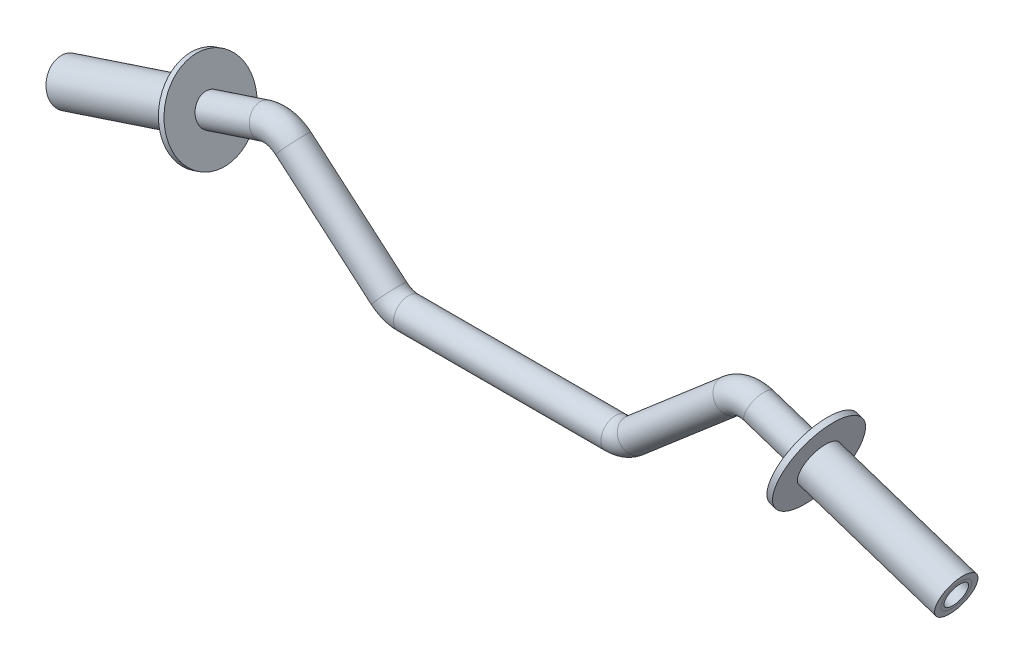
ISO-10303-21;
HEADER;
FILE_DESCRIPTION(('STEP AP214'),'2;1');
FILE_NAME('part.step','',(''),(''),'','','');
FILE_SCHEMA(('AUTOMOTIVE_DESIGN { 1 0 10303 214 1 1 1 1 }'));
ENDSEC;
DATA;
#1=APPLICATION_CONTEXT('core data for automotive mechanical design processes');
#2=APPLICATION_PROTOCOL_DEFINITION('international standard','automotive_design',2000,#1);
#3=PRODUCT_CONTEXT('',#1,'mechanical');
#4=PRODUCT('Part','Part','',(#3));
#5=PRODUCT_RELATED_PRODUCT_CATEGORY('part','',(#4));
#6=PRODUCT_DEFINITION_FORMATION('','',#4);
#7=PRODUCT_DEFINITION_CONTEXT('part definition',#1,'design');
#8=PRODUCT_DEFINITION('design','',#6,#7);
#9=PRODUCT_DEFINITION_SHAPE('','',#8);
#10=(LENGTH_UNIT() NAMED_UNIT(*) SI_UNIT(.MILLI.,.METRE.));
#11=(NAMED_UNIT(*) PLANE_ANGLE_UNIT() SI_UNIT($,.RADIAN.));
#12=(NAMED_UNIT(*) SI_UNIT($,.STERADIAN.) SOLID_ANGLE_UNIT());
#13=UNCERTAINTY_MEASURE_WITH_UNIT(LENGTH_MEASURE(1.E-05),#10,'distance_accuracy_value','');
#14=(GEOMETRIC_REPRESENTATION_CONTEXT(3) GLOBAL_UNCERTAINTY_ASSIGNED_CONTEXT((#13)) GLOBAL_UNIT_ASSIGNED_CONTEXT((#10,
#11,#12)) REPRESENTATION_CONTEXT('',''));
#15=CARTESIAN_POINT('',(0.,0.,0.));
#16=DIRECTION('',(0.,0.,1.));
#17=DIRECTION('',(1.,0.,0.));
#18=AXIS2_PLACEMENT_3D('',#15,#16,#17);
#19=CARTESIAN_POINT('',(-166.897824544563,63.9897667994018,0.));
#20=DIRECTION('',(-0.949488339970091,-0.313802313982609,0.));
#21=DIRECTION('',(-0.313802313982609,0.949488339970091,0.));
#22=AXIS2_PLACEMENT_3D('',#19,#20,#21);
#23=CYLINDRICAL_SURFACE('',#22,10.);
#24=CARTESIAN_POINT('',(-166.897824544563,63.9897667994018,0.));
#25=DIRECTION('',(0.949488339970091,0.31380231398261,0.));
#26=DIRECTION('',(0.,0.,-1.));
#27=AXIS2_PLACEMENT_3D('',#24,#25,#26);
#28=CIRCLE('',#27,10.);
#29=CARTESIAN_POINT('',(-170.035847684389,73.4846501991027,0.));
#30=VERTEX_POINT('',#29);
#31=EDGE_CURVE('E55',#30,#30,#28,.T.);
#32=ORIENTED_EDGE('',*,*,#31,.F.);
#33=EDGE_LOOP('',(#32));
#34=FACE_BOUND('',#33,.T.);
#35=CARTESIAN_POINT('',(-300.,20.,0.));
#36=DIRECTION('',(0.949488339970091,0.31380231398261,0.));
#37=DIRECTION('',(0.,0.,-1.));
#38=AXIS2_PLACEMENT_3D('',#35,#36,#37);
#39=CIRCLE('',#38,10.);
#40=CARTESIAN_POINT('',(-300.,20.,-10.));
#41=VERTEX_POINT('',#40);
#42=EDGE_CURVE('E11',#41,#41,#39,.T.);
#43=ORIENTED_EDGE('',*,*,#42,.T.);
#44=EDGE_LOOP('',(#43));
#45=FACE_BOUND('',#44,.T.);
#46=ADVANCED_FACE('F45',(#34,#45),#23,.T.);
#47=CARTESIAN_POINT('',(-166.897824544563,63.9897667994018,0.));
#48=DIRECTION('',(-0.949488339970091,-0.313802313982609,0.));
#49=DIRECTION('',(-0.313802313982609,0.949488339970091,0.));
#50=AXIS2_PLACEMENT_3D('',#47,#48,#49);
#51=CYLINDRICAL_SURFACE('',#50,8.);
#52=CARTESIAN_POINT('',(-166.897824544563,63.9897667994018,0.));
#53=DIRECTION('',(0.949488339970091,0.31380231398261,0.));
#54=DIRECTION('',(0.,0.,-1.));
#55=AXIS2_PLACEMENT_3D('',#52,#53,#54);
#56=CIRCLE('',#55,8.);
#57=CARTESIAN_POINT('',(-169.408243056424,71.5856735191626,0.));
#58=VERTEX_POINT('',#57);
#59=EDGE_CURVE('E59',#58,#58,#56,.T.);
#60=ORIENTED_EDGE('',*,*,#59,.T.);
#61=EDGE_LOOP('',(#60));
#62=FACE_BOUND('',#61,.T.);
#63=CARTESIAN_POINT('',(-300.,20.,0.));
#64=DIRECTION('',(0.949488339970091,0.31380231398261,0.));
#65=DIRECTION('',(0.,0.,-1.));
#66=AXIS2_PLACEMENT_3D('',#63,#64,#65);
#67=CIRCLE('',#66,8.);
#68=CARTESIAN_POINT('',(-300.,20.,-8.));
#69=VERTEX_POINT('',#68);
#70=EDGE_CURVE('E51',#69,#69,#67,.T.);
#71=ORIENTED_EDGE('',*,*,#70,.F.);
#72=EDGE_LOOP('',(#71));
#73=FACE_BOUND('',#72,.T.);
#74=ADVANCED_FACE('F159',(#62,#73),#51,.F.);
#75=CARTESIAN_POINT('',(-160.621778264911,45.,0.));
#76=DIRECTION('',(0.,0.,-1.));
#77=DIRECTION('',(1.,0.,0.));
#78=AXIS2_PLACEMENT_3D('',#75,#76,#77);
#79=TOROIDAL_SURFACE('',#78,20.,10.);
#80=CARTESIAN_POINT('',(-147.604961339319,60.1842838858353,0.));
#81=DIRECTION('',(0.759214194291763,-0.650840846279571,0.));
#82=DIRECTION('',(0.,0.,-1.));
#83=AXIS2_PLACEMENT_3D('',#80,#81,#82);
#84=CIRCLE('',#83,10.);
#85=CARTESIAN_POINT('',(-141.096552876523,67.7764258287529,0.));
#86=VERTEX_POINT('',#85);
#87=EDGE_CURVE('E64',#86,#86,#84,.T.);
#88=CARTESIAN_POINT('',(-160.621778264911,45.,0.));
#89=DIRECTION('',(0.,0.,-1.));
#90=DIRECTION('',(1.,0.,0.));
#91=AXIS2_PLACEMENT_3D('',#88,#89,#90);
#92=CIRCLE('',#91,30.);
#93=EDGE_CURVE('',#30,#86,#92,.T.);
#94=ORIENTED_EDGE('',*,*,#31,.T.);
#95=ORIENTED_EDGE('',*,*,#87,.F.);
#96=ORIENTED_EDGE('',*,*,#93,.T.);
#97=ORIENTED_EDGE('',*,*,#93,.F.);
#98=EDGE_LOOP('',(#94,#96,#95,#97));
#99=FACE_BOUND('',#98,.T.);
#100=ADVANCED_FACE('F164',(#99),#79,.T.);
#101=CARTESIAN_POINT('',(-160.621778264911,45.,0.));
#102=DIRECTION('',(0.,0.,-1.));
#103=DIRECTION('',(1.,0.,0.));
#104=AXIS2_PLACEMENT_3D('',#101,#102,#103);
#105=TOROIDAL_SURFACE('',#104,20.,8.);
#106=CARTESIAN_POINT('',(-147.604961339319,60.1842838858353,0.));
#107=DIRECTION('',(0.759214194291763,-0.650840846279571,0.));
#108=DIRECTION('',(0.,0.,-1.));
#109=AXIS2_PLACEMENT_3D('',#106,#107,#108);
#110=CIRCLE('',#109,8.);
#111=CARTESIAN_POINT('',(-142.398234569083,66.2579974401694,0.));
#112=VERTEX_POINT('',#111);
#113=EDGE_CURVE('E67',#112,#112,#110,.T.);
#114=CARTESIAN_POINT('',(-160.621778264911,45.,0.));
#115=DIRECTION('',(0.,0.,-1.));
#116=DIRECTION('',(1.,0.,0.));
#117=AXIS2_PLACEMENT_3D('',#114,#115,#116);
#118=CIRCLE('',#117,28.);
#119=EDGE_CURVE('',#58,#112,#118,.T.);
#120=ORIENTED_EDGE('',*,*,#59,.F.);
#121=ORIENTED_EDGE('',*,*,#113,.T.);
#122=ORIENTED_EDGE('',*,*,#119,.T.);
#123=ORIENTED_EDGE('',*,*,#119,.F.);
#124=EDGE_LOOP('',(#120,#122,#121,#123));
#125=FACE_BOUND('',#124,.T.);
#126=ADVANCED_FACE('F169',(#125),#105,.F.);
#127=CARTESIAN_POINT('',(-83.0168169255914,4.81571611416473,0.));
#128=DIRECTION('',(-0.759214194291763,0.650840846279572,0.));
#129=DIRECTION('',(0.650840846279572,0.759214194291763,0.));
#130=AXIS2_PLACEMENT_3D('',#127,#128,#129);
#131=CYLINDRICAL_SURFACE('',#130,10.);
#132=CARTESIAN_POINT('',(-83.0168169255914,4.81571611416473,0.));
#133=DIRECTION('',(0.759214194291763,-0.650840846279571,0.));
#134=DIRECTION('',(0.,0.,-1.));
#135=AXIS2_PLACEMENT_3D('',#132,#133,#134);
#136=CIRCLE('',#135,10.);
#137=CARTESIAN_POINT('',(-89.5252253883871,-2.77642582875291,0.));
#138=VERTEX_POINT('',#137);
#139=EDGE_CURVE('E70',#138,#138,#136,.T.);
#140=ORIENTED_EDGE('',*,*,#139,.F.);
#141=EDGE_LOOP('',(#140));
#142=FACE_BOUND('',#141,.T.);
#143=ORIENTED_EDGE('',*,*,#87,.T.);
#144=EDGE_LOOP('',(#143));
#145=FACE_BOUND('',#144,.T.);
#146=ADVANCED_FACE('F175',(#142,#145),#131,.T.);
#147=CARTESIAN_POINT('',(-83.0168169255914,4.81571611416473,0.));
#148=DIRECTION('',(-0.759214194291763,0.650840846279572,0.));
#149=DIRECTION('',(0.650840846279572,0.759214194291763,0.));
#150=AXIS2_PLACEMENT_3D('',#147,#148,#149);
#151=CYLINDRICAL_SURFACE('',#150,8.);
#152=CARTESIAN_POINT('',(-83.0168169255914,4.81571611416473,0.));
#153=DIRECTION('',(0.759214194291763,-0.650840846279571,0.));
#154=DIRECTION('',(0.,0.,-1.));
#155=AXIS2_PLACEMENT_3D('',#152,#153,#154);
#156=CIRCLE('',#155,8.);
#157=CARTESIAN_POINT('',(-88.223543695828,-1.25799744016938,0.));
#158=VERTEX_POINT('',#157);
#159=EDGE_CURVE('E73',#158,#158,#156,.T.);
#160=ORIENTED_EDGE('',*,*,#159,.T.);
#161=EDGE_LOOP('',(#160));
#162=FACE_BOUND('',#161,.T.);
#163=ORIENTED_EDGE('',*,*,#113,.F.);
#164=EDGE_LOOP('',(#163));
#165=FACE_BOUND('',#164,.T.);
#166=ADVANCED_FACE('F182',(#162,#165),#151,.F.);
#167=CARTESIAN_POINT('',(-70.,20.,0.));
#168=DIRECTION('',(0.,0.,1.));
#169=DIRECTION('',(-1.,0.,0.));
#170=AXIS2_PLACEMENT_3D('',#167,#168,#169);
#171=TOROIDAL_SURFACE('',#170,20.,10.);
#172=CARTESIAN_POINT('',(-70.,0.,0.));
#173=DIRECTION('',(1.,0.,0.));
#174=DIRECTION('',(0.,0.,-1.));
#175=AXIS2_PLACEMENT_3D('',#172,#173,#174);
#176=CIRCLE('',#175,10.);
#177=CARTESIAN_POINT('',(-70.,-10.,0.));
#178=VERTEX_POINT('',#177);
#179=EDGE_CURVE('E76',#178,#178,#176,.T.);
#180=CARTESIAN_POINT('',(-70.,20.,0.));
#181=DIRECTION('',(0.,0.,1.));
#182=DIRECTION('',(-1.,0.,0.));
#183=AXIS2_PLACEMENT_3D('',#180,#181,#182);
#184=CIRCLE('',#183,30.);
#185=EDGE_CURVE('',#138,#178,#184,.T.);
#186=ORIENTED_EDGE('',*,*,#139,.T.);
#187=ORIENTED_EDGE('',*,*,#179,.F.);
#188=ORIENTED_EDGE('',*,*,#185,.T.);
#189=ORIENTED_EDGE('',*,*,#185,.F.);
#190=EDGE_LOOP('',(#186,#188,#187,#189));
#191=FACE_BOUND('',#190,.T.);
#192=ADVANCED_FACE('F186',(#191),#171,.T.);
#193=CARTESIAN_POINT('',(-70.,20.,0.));
#194=DIRECTION('',(0.,0.,1.));
#195=DIRECTION('',(-1.,0.,0.));
#196=AXIS2_PLACEMENT_3D('',#193,#194,#195);
#197=TOROIDAL_SURFACE('',#196,20.,8.);
#198=CARTESIAN_POINT('',(-70.,0.,0.));
#199=DIRECTION('',(1.,0.,0.));
#200=DIRECTION('',(0.,0.,-1.));
#201=AXIS2_PLACEMENT_3D('',#198,#199,#200);
#202=CIRCLE('',#201,8.);
#203=CARTESIAN_POINT('',(-70.,-8.,0.));
#204=VERTEX_POINT('',#203);
#205=EDGE_CURVE('E79',#204,#204,#202,.T.);
#206=CARTESIAN_POINT('',(-70.,20.,0.));
#207=DIRECTION('',(0.,0.,1.));
#208=DIRECTION('',(-1.,0.,0.));
#209=AXIS2_PLACEMENT_3D('',#206,#207,#208);
#210=CIRCLE('',#209,28.);
#211=EDGE_CURVE('',#158,#204,#210,.T.);
#212=ORIENTED_EDGE('',*,*,#159,.F.);
#213=ORIENTED_EDGE('',*,*,#205,.T.);
#214=ORIENTED_EDGE('',*,*,#211,.T.);
#215=ORIENTED_EDGE('',*,*,#211,.F.);
#216=EDGE_LOOP('',(#212,#214,#213,#215));
#217=FACE_BOUND('',#216,.T.);
#218=ADVANCED_FACE('F190',(#217),#197,.F.);
#219=CARTESIAN_POINT('',(-70.,0.,0.));
#220=DIRECTION('',(1.,0.,0.));
#221=DIRECTION('',(0.,0.,1.));
#222=AXIS2_PLACEMENT_3D('',#219,#220,#221);
#223=CYLINDRICAL_SURFACE('',#222,8.);
#224=ORIENTED_EDGE('',*,*,#205,.F.);
#225=EDGE_LOOP('',(#224));
#226=FACE_BOUND('',#225,.T.);
#227=CARTESIAN_POINT('',(70.,0.,0.));
#228=DIRECTION('',(1.,0.,0.));
#229=DIRECTION('',(0.,0.,-1.));
#230=AXIS2_PLACEMENT_3D('',#227,#228,#229);
#231=CIRCLE('',#230,8.);
#232=CARTESIAN_POINT('',(70.,-8.,0.));
#233=VERTEX_POINT('',#232);
#234=EDGE_CURVE('E109',#233,#233,#231,.T.);
#235=ORIENTED_EDGE('',*,*,#234,.T.);
#236=EDGE_LOOP('',(#235));
#237=FACE_BOUND('',#236,.T.);
#238=ADVANCED_FACE('F113',(#226,#237),#223,.F.);
#239=CARTESIAN_POINT('',(-70.,0.,0.));
#240=DIRECTION('',(1.,0.,0.));
#241=DIRECTION('',(0.,0.,1.));
#242=AXIS2_PLACEMENT_3D('',#239,#240,#241);
#243=CYLINDRICAL_SURFACE('',#242,10.);
#244=ORIENTED_EDGE('',*,*,#179,.T.);
#245=EDGE_LOOP('',(#244));
#246=FACE_BOUND('',#245,.T.);
#247=CARTESIAN_POINT('',(70.,0.,0.));
#248=DIRECTION('',(1.,0.,0.));
#249=DIRECTION('',(0.,0.,-1.));
#250=AXIS2_PLACEMENT_3D('',#247,#248,#249);
#251=CIRCLE('',#250,10.);
#252=CARTESIAN_POINT('',(70.,-10.,0.));
#253=VERTEX_POINT('',#252);
#254=EDGE_CURVE('E106',#253,#253,#251,.T.);
#255=ORIENTED_EDGE('',*,*,#254,.F.);
#256=EDGE_LOOP('',(#255));
#257=FACE_BOUND('',#256,.T.);
#258=ADVANCED_FACE('F156',(#246,#257),#243,.T.);
#259=CARTESIAN_POINT('',(-300.,20.,0.));
#260=DIRECTION('',(-0.949488339970091,-0.31380231398261,0.));
#261=DIRECTION('',(0.,0.,-1.));
#262=AXIS2_PLACEMENT_3D('',#259,#260,#261);
#263=PLANE('',#262);
#264=ORIENTED_EDGE('',*,*,#70,.T.);
#265=EDGE_LOOP('',(#264));
#266=FACE_BOUND('',#265,.T.);
#267=ORIENTED_EDGE('',*,*,#42,.F.);
#268=EDGE_LOOP('',(#267));
#269=FACE_BOUND('',#268,.T.);
#270=ADVANCED_FACE('F150',(#266,#269),#263,.T.);
#271=CARTESIAN_POINT('',(166.897824544563,63.9897667994018,0.));
#272=DIRECTION('',(0.949488339970091,-0.313802313982609,0.));
#273=DIRECTION('',(0.313802313982609,0.949488339970091,0.));
#274=AXIS2_PLACEMENT_3D('',#271,#272,#273);
#275=CYLINDRICAL_SURFACE('',#274,10.);
#276=CARTESIAN_POINT('',(166.897824544563,63.9897667994018,0.));
#277=DIRECTION('',(0.949488339970091,-0.31380231398261,0.));
#278=DIRECTION('',(0.,0.,-1.));
#279=AXIS2_PLACEMENT_3D('',#276,#277,#278);
#280=CIRCLE('',#279,10.);
#281=CARTESIAN_POINT('',(170.035847684389,73.4846501991027,0.));
#282=VERTEX_POINT('',#281);
#283=EDGE_CURVE('E88',#282,#282,#280,.T.);
#284=ORIENTED_EDGE('',*,*,#283,.T.);
#285=EDGE_LOOP('',(#284));
#286=FACE_BOUND('',#285,.T.);
#287=CARTESIAN_POINT('',(300.,20.,0.));
#288=DIRECTION('',(0.949488339970091,-0.31380231398261,0.));
#289=DIRECTION('',(0.,0.,-1.));
#290=AXIS2_PLACEMENT_3D('',#287,#288,#289);
#291=CIRCLE('',#290,10.);
#292=CARTESIAN_POINT('',(300.,20.,-10.));
#293=VERTEX_POINT('',#292);
#294=EDGE_CURVE('E82',#293,#293,#291,.T.);
#295=ORIENTED_EDGE('',*,*,#294,.F.);
#296=EDGE_LOOP('',(#295));
#297=FACE_BOUND('',#296,.T.);
#298=ADVANCED_FACE('F140',(#286,#297),#275,.T.);
#299=CARTESIAN_POINT('',(166.897824544563,63.9897667994018,0.));
#300=DIRECTION('',(0.949488339970091,-0.313802313982609,0.));
#301=DIRECTION('',(0.313802313982609,0.949488339970091,0.));
#302=AXIS2_PLACEMENT_3D('',#299,#300,#301);
#303=CYLINDRICAL_SURFACE('',#302,8.);
#304=CARTESIAN_POINT('',(166.897824544563,63.9897667994018,0.));
#305=DIRECTION('',(0.949488339970091,-0.31380231398261,0.));
#306=DIRECTION('',(0.,0.,-1.));
#307=AXIS2_PLACEMENT_3D('',#304,#305,#306);
#308=CIRCLE('',#307,8.);
#309=CARTESIAN_POINT('',(169.408243056424,71.5856735191626,0.));
#310=VERTEX_POINT('',#309);
#311=EDGE_CURVE('E91',#310,#310,#308,.T.);
#312=ORIENTED_EDGE('',*,*,#311,.F.);
#313=EDGE_LOOP('',(#312));
#314=FACE_BOUND('',#313,.T.);
#315=CARTESIAN_POINT('',(300.,20.,0.));
#316=DIRECTION('',(0.949488339970091,-0.31380231398261,0.));
#317=DIRECTION('',(0.,0.,-1.));
#318=AXIS2_PLACEMENT_3D('',#315,#316,#317);
#319=CIRCLE('',#318,8.);
#320=CARTESIAN_POINT('',(300.,20.,-8.));
#321=VERTEX_POINT('',#320);
#322=EDGE_CURVE('E85',#321,#321,#319,.T.);
#323=ORIENTED_EDGE('',*,*,#322,.T.);
#324=EDGE_LOOP('',(#323));
#325=FACE_BOUND('',#324,.T.);
#326=ADVANCED_FACE('F137',(#314,#325),#303,.F.);
#327=CARTESIAN_POINT('',(160.621778264911,45.,0.));
#328=DIRECTION('',(0.,0.,-1.));
#329=DIRECTION('',(-1.,0.,0.));
#330=AXIS2_PLACEMENT_3D('',#327,#328,#329);
#331=TOROIDAL_SURFACE('',#330,20.,10.);
#332=CARTESIAN_POINT('',(147.604961339319,60.1842838858353,0.));
#333=DIRECTION('',(0.759214194291763,0.650840846279571,0.));
#334=DIRECTION('',(0.,0.,-1.));
#335=AXIS2_PLACEMENT_3D('',#332,#333,#334);
#336=CIRCLE('',#335,10.);
#337=CARTESIAN_POINT('',(141.096552876523,67.7764258287529,0.));
#338=VERTEX_POINT('',#337);
#339=EDGE_CURVE('E94',#338,#338,#336,.T.);
#340=CARTESIAN_POINT('',(160.621778264911,45.,0.));
#341=DIRECTION('',(0.,0.,-1.));
#342=DIRECTION('',(-1.,0.,0.));
#343=AXIS2_PLACEMENT_3D('',#340,#341,#342);
#344=CIRCLE('',#343,30.);
#345=EDGE_CURVE('',#338,#282,#344,.T.);
#346=ORIENTED_EDGE('',*,*,#339,.T.);
#347=ORIENTED_EDGE('',*,*,#283,.F.);
#348=ORIENTED_EDGE('',*,*,#345,.T.);
#349=ORIENTED_EDGE('',*,*,#345,.F.);
#350=EDGE_LOOP('',(#346,#348,#347,#349));
#351=FACE_BOUND('',#350,.T.);
#352=ADVANCED_FACE('F133',(#351),#331,.T.);
#353=CARTESIAN_POINT('',(160.621778264911,45.,0.));
#354=DIRECTION('',(0.,0.,-1.));
#355=DIRECTION('',(-1.,0.,0.));
#356=AXIS2_PLACEMENT_3D('',#353,#354,#355);
#357=TOROIDAL_SURFACE('',#356,20.,8.);
#358=CARTESIAN_POINT('',(147.604961339319,60.1842838858353,0.));
#359=DIRECTION('',(0.759214194291763,0.650840846279571,0.));
#360=DIRECTION('',(0.,0.,-1.));
#361=AXIS2_PLACEMENT_3D('',#358,#359,#360);
#362=CIRCLE('',#361,8.);
#363=CARTESIAN_POINT('',(142.398234569083,66.2579974401694,0.));
#364=VERTEX_POINT('',#363);
#365=EDGE_CURVE('E97',#364,#364,#362,.T.);
#366=CARTESIAN_POINT('',(160.621778264911,45.,0.));
#367=DIRECTION('',(0.,0.,-1.));
#368=DIRECTION('',(-1.,0.,0.));
#369=AXIS2_PLACEMENT_3D('',#366,#367,#368);
#370=CIRCLE('',#369,28.);
#371=EDGE_CURVE('',#364,#310,#370,.T.);
#372=ORIENTED_EDGE('',*,*,#365,.F.);
#373=ORIENTED_EDGE('',*,*,#311,.T.);
#374=ORIENTED_EDGE('',*,*,#371,.T.);
#375=ORIENTED_EDGE('',*,*,#371,.F.);
#376=EDGE_LOOP('',(#372,#374,#373,#375));
#377=FACE_BOUND('',#376,.T.);
#378=ADVANCED_FACE('F130',(#377),#357,.F.);
#379=CARTESIAN_POINT('',(83.0168169255914,4.81571611416473,0.));
#380=DIRECTION('',(0.759214194291763,0.650840846279572,0.));
#381=DIRECTION('',(-0.650840846279572,0.759214194291763,0.));
#382=AXIS2_PLACEMENT_3D('',#379,#380,#381);
#383=CYLINDRICAL_SURFACE('',#382,10.);
#384=CARTESIAN_POINT('',(83.0168169255914,4.81571611416473,0.));
#385=DIRECTION('',(0.759214194291763,0.650840846279571,0.));
#386=DIRECTION('',(0.,0.,-1.));
#387=AXIS2_PLACEMENT_3D('',#384,#385,#386);
#388=CIRCLE('',#387,10.);
#389=CARTESIAN_POINT('',(89.5252253883871,-2.77642582875291,0.));
#390=VERTEX_POINT('',#389);
#391=EDGE_CURVE('E100',#390,#390,#388,.T.);
#392=ORIENTED_EDGE('',*,*,#391,.T.);
#393=EDGE_LOOP('',(#392));
#394=FACE_BOUND('',#393,.T.);
#395=ORIENTED_EDGE('',*,*,#339,.F.);
#396=EDGE_LOOP('',(#395));
#397=FACE_BOUND('',#396,.T.);
#398=ADVANCED_FACE('F126',(#394,#397),#383,.T.);
#399=CARTESIAN_POINT('',(83.0168169255914,4.81571611416473,0.));
#400=DIRECTION('',(0.759214194291763,0.650840846279572,0.));
#401=DIRECTION('',(-0.650840846279572,0.759214194291763,0.));
#402=AXIS2_PLACEMENT_3D('',#399,#400,#401);
#403=CYLINDRICAL_SURFACE('',#402,8.);
#404=CARTESIAN_POINT('',(83.0168169255914,4.81571611416473,0.));
#405=DIRECTION('',(0.759214194291763,0.650840846279571,0.));
#406=DIRECTION('',(0.,0.,-1.));
#407=AXIS2_PLACEMENT_3D('',#404,#405,#406);
#408=CIRCLE('',#407,8.);
#409=CARTESIAN_POINT('',(88.223543695828,-1.25799744016938,0.));
#410=VERTEX_POINT('',#409);
#411=EDGE_CURVE('E103',#410,#410,#408,.T.);
#412=ORIENTED_EDGE('',*,*,#411,.F.);
#413=EDGE_LOOP('',(#412));
#414=FACE_BOUND('',#413,.T.);
#415=ORIENTED_EDGE('',*,*,#365,.T.);
#416=EDGE_LOOP('',(#415));
#417=FACE_BOUND('',#416,.T.);
#418=ADVANCED_FACE('F123',(#414,#417),#403,.F.);
#419=CARTESIAN_POINT('',(70.,20.,0.));
#420=DIRECTION('',(0.,0.,1.));
#421=DIRECTION('',(1.,0.,0.));
#422=AXIS2_PLACEMENT_3D('',#419,#420,#421);
#423=TOROIDAL_SURFACE('',#422,20.,10.);
#424=CARTESIAN_POINT('',(70.,20.,0.));
#425=DIRECTION('',(0.,0.,1.));
#426=DIRECTION('',(1.,0.,0.));
#427=AXIS2_PLACEMENT_3D('',#424,#425,#426);
#428=CIRCLE('',#427,30.);
#429=EDGE_CURVE('',#253,#390,#428,.T.);
#430=ORIENTED_EDGE('',*,*,#254,.T.);
#431=ORIENTED_EDGE('',*,*,#391,.F.);
#432=ORIENTED_EDGE('',*,*,#429,.T.);
#433=ORIENTED_EDGE('',*,*,#429,.F.);
#434=EDGE_LOOP('',(#430,#432,#431,#433));
#435=FACE_BOUND('',#434,.T.);
#436=ADVANCED_FACE('F119',(#435),#423,.T.);
#437=CARTESIAN_POINT('',(70.,20.,0.));
#438=DIRECTION('',(0.,0.,1.));
#439=DIRECTION('',(1.,0.,0.));
#440=AXIS2_PLACEMENT_3D('',#437,#438,#439);
#441=TOROIDAL_SURFACE('',#440,20.,8.);
#442=CARTESIAN_POINT('',(70.,20.,0.));
#443=DIRECTION('',(0.,0.,1.));
#444=DIRECTION('',(1.,0.,0.));
#445=AXIS2_PLACEMENT_3D('',#442,#443,#444);
#446=CIRCLE('',#445,28.);
#447=EDGE_CURVE('',#233,#410,#446,.T.);
#448=ORIENTED_EDGE('',*,*,#234,.F.);
#449=ORIENTED_EDGE('',*,*,#411,.T.);
#450=ORIENTED_EDGE('',*,*,#447,.T.);
#451=ORIENTED_EDGE('',*,*,#447,.F.);
#452=EDGE_LOOP('',(#448,#450,#449,#451));
#453=FACE_BOUND('',#452,.T.);
#454=ADVANCED_FACE('F115',(#453),#441,.F.);
#455=CARTESIAN_POINT('',(300.,20.,0.));
#456=DIRECTION('',(0.949488339970091,-0.31380231398261,0.));
#457=DIRECTION('',(0.,0.,-1.));
#458=AXIS2_PLACEMENT_3D('',#455,#456,#457);
#459=PLANE('',#458);
#460=ORIENTED_EDGE('',*,*,#322,.F.);
#461=EDGE_LOOP('',(#460));
#462=FACE_BOUND('',#461,.T.);
#463=ORIENTED_EDGE('',*,*,#294,.T.);
#464=EDGE_LOOP('',(#463));
#465=FACE_BOUND('',#464,.T.);
#466=ADVANCED_FACE('F118',(#462,#465),#459,.T.);
#467=CLOSED_SHELL('',(#46,#74,#100,#126,#146,#166,#192,#218,#238,#258,#270,#298,#326,#352,#378,
#398,#418,#436,#454,#466));
#468=MANIFOLD_SOLID_BREP('B2',#467);
#469=CARTESIAN_POINT('',(-295.606767604244,6.70716324041878,0.));
#470=DIRECTION('',(0.949488339970092,0.313802313982609,0.));
#471=DIRECTION('',(0.313802313982609,-0.949488339970092,0.));
#472=AXIS2_PLACEMENT_3D('',#469,#470,#471);
#473=PLANE('',#472);
#474=CARTESIAN_POINT('',(-300.,20.0000000000001,0.));
#475=DIRECTION('',(0.949488339970092,0.313802313982609,0.));
#476=DIRECTION('',(-0.313802313982609,0.949488339970092,0.));
#477=AXIS2_PLACEMENT_3D('',#474,#475,#476);
#478=CIRCLE('',#477,10.);
#479=CARTESIAN_POINT('',(-303.138023139826,29.494883399701,0.));
#480=VERTEX_POINT('',#479);
#481=EDGE_CURVE('E44',#480,#480,#478,.T.);
#482=ORIENTED_EDGE('',*,*,#481,.T.);
#483=EDGE_LOOP('',(#482));
#484=FACE_BOUND('',#483,.T.);
#485=CARTESIAN_POINT('',(-300.,20.,0.));
#486=DIRECTION('',(0.949488339970092,0.313802313982609,0.));
#487=DIRECTION('',(-0.313802313982609,0.949488339970092,0.));
#488=AXIS2_PLACEMENT_3D('',#485,#486,#487);
#489=CIRCLE('',#488,14.);
#490=CARTESIAN_POINT('',(-304.393232395757,33.2928367595813,0.));
#491=VERTEX_POINT('',#490);
#492=EDGE_CURVE('E392',#491,#491,#489,.T.);
#493=ORIENTED_EDGE('',*,*,#492,.F.);
#494=EDGE_LOOP('',(#493));
#495=FACE_BOUND('',#494,.T.);
#496=ADVANCED_FACE('F370',(#484,#495),#473,.F.);
#497=CARTESIAN_POINT('',(-300.,20.,0.));
#498=DIRECTION('',(-0.949488339970092,-0.313802313982609,0.));
#499=DIRECTION('',(-0.313802313982609,0.949488339970092,0.));
#500=AXIS2_PLACEMENT_3D('',#497,#498,#499);
#501=CYLINDRICAL_SURFACE('',#500,10.);
#502=CARTESIAN_POINT('',(-203.531984659039,51.8823151006332,0.));
#503=DIRECTION('',(0.949488339970092,0.313802313982609,0.));
#504=DIRECTION('',(-0.313802313982609,0.949488339970092,0.));
#505=AXIS2_PLACEMENT_3D('',#502,#503,#504);
#506=CIRCLE('',#505,10.);
#507=CARTESIAN_POINT('',(-206.670007798865,61.3771985003341,0.));
#508=VERTEX_POINT('',#507);
#509=EDGE_CURVE('E376',#508,#508,#506,.T.);
#510=ORIENTED_EDGE('',*,*,#509,.T.);
#511=EDGE_LOOP('',(#510));
#512=FACE_BOUND('',#511,.T.);
#513=ORIENTED_EDGE('',*,*,#481,.F.);
#514=EDGE_LOOP('',(#513));
#515=FACE_BOUND('',#514,.T.);
#516=ADVANCED_FACE('F400',(#512,#515),#501,.F.);
#517=CARTESIAN_POINT('',(-200.393961519213,42.3874317009322,0.));
#518=DIRECTION('',(-0.949488339970092,-0.313802313982609,0.));
#519=DIRECTION('',(-0.313802313982609,0.949488339970092,0.));
#520=AXIS2_PLACEMENT_3D('',#517,#518,#519);
#521=PLANE('',#520);
#522=CARTESIAN_POINT('',(-203.531984659039,51.8823151006331,0.));
#523=DIRECTION('',(0.949488339970092,0.313802313982609,0.));
#524=DIRECTION('',(-0.313802313982609,0.949488339970092,0.));
#525=AXIS2_PLACEMENT_3D('',#522,#523,#524);
#526=CIRCLE('',#525,30.);
#527=CARTESIAN_POINT('',(-212.946054078517,80.3669652997359,0.));
#528=VERTEX_POINT('',#527);
#529=EDGE_CURVE('E380',#528,#528,#526,.T.);
#530=ORIENTED_EDGE('',*,*,#529,.T.);
#531=EDGE_LOOP('',(#530));
#532=FACE_BOUND('',#531,.T.);
#533=ORIENTED_EDGE('',*,*,#509,.F.);
#534=EDGE_LOOP('',(#533));
#535=FACE_BOUND('',#534,.T.);
#536=ADVANCED_FACE('F404',(#532,#535),#521,.F.);
#537=CARTESIAN_POINT('',(-300.,20.,0.));
#538=DIRECTION('',(-0.949488339970092,-0.313802313982609,0.));
#539=DIRECTION('',(-0.313802313982609,0.949488339970092,0.));
#540=AXIS2_PLACEMENT_3D('',#537,#538,#539);
#541=CYLINDRICAL_SURFACE('',#540,30.);
#542=CARTESIAN_POINT('',(-207.329938018919,50.6271058447027,0.));
#543=DIRECTION('',(0.949488339970092,0.313802313982609,0.));
#544=DIRECTION('',(-0.313802313982609,0.949488339970092,0.));
#545=AXIS2_PLACEMENT_3D('',#542,#543,#544);
#546=CIRCLE('',#545,30.);
#547=CARTESIAN_POINT('',(-216.744007438397,79.1117560438055,0.));
#548=VERTEX_POINT('',#547);
#549=EDGE_CURVE('E384',#548,#548,#546,.T.);
#550=ORIENTED_EDGE('',*,*,#549,.T.);
#551=EDGE_LOOP('',(#550));
#552=FACE_BOUND('',#551,.T.);
#553=ORIENTED_EDGE('',*,*,#529,.F.);
#554=EDGE_LOOP('',(#553));
#555=FACE_BOUND('',#554,.T.);
#556=ADVANCED_FACE('F408',(#552,#555),#541,.T.);
#557=CARTESIAN_POINT('',(-197.915868599441,22.1424556455999,0.));
#558=DIRECTION('',(0.949488339970092,0.313802313982609,0.));
#559=DIRECTION('',(0.313802313982609,-0.949488339970092,0.));
#560=AXIS2_PLACEMENT_3D('',#557,#558,#559);
#561=PLANE('',#560);
#562=CARTESIAN_POINT('',(-207.329938018919,50.6271058447027,0.));
#563=DIRECTION('',(0.949488339970092,0.313802313982609,0.));
#564=DIRECTION('',(-0.313802313982609,0.949488339970092,0.));
#565=AXIS2_PLACEMENT_3D('',#562,#563,#564);
#566=CIRCLE('',#565,14.);
#567=CARTESIAN_POINT('',(-211.723170414676,63.919942604284,0.));
#568=VERTEX_POINT('',#567);
#569=EDGE_CURVE('E389',#568,#568,#566,.T.);
#570=ORIENTED_EDGE('',*,*,#569,.T.);
#571=EDGE_LOOP('',(#570));
#572=FACE_BOUND('',#571,.T.);
#573=ORIENTED_EDGE('',*,*,#549,.F.);
#574=EDGE_LOOP('',(#573));
#575=FACE_BOUND('',#574,.T.);
#576=ADVANCED_FACE('F415',(#572,#575),#561,.F.);
#577=CARTESIAN_POINT('',(-300.,20.,0.));
#578=DIRECTION('',(-0.949488339970092,-0.313802313982609,0.));
#579=DIRECTION('',(-0.313802313982609,0.949488339970092,0.));
#580=AXIS2_PLACEMENT_3D('',#577,#578,#579);
#581=CYLINDRICAL_SURFACE('',#580,14.);
#582=ORIENTED_EDGE('',*,*,#492,.T.);
#583=EDGE_LOOP('',(#582));
#584=FACE_BOUND('',#583,.T.);
#585=ORIENTED_EDGE('',*,*,#569,.F.);
#586=EDGE_LOOP('',(#585));
#587=FACE_BOUND('',#586,.T.);
#588=ADVANCED_FACE('F396',(#584,#587),#581,.T.);
#589=CLOSED_SHELL('',(#496,#516,#536,#556,#576,#588));
#590=MANIFOLD_SOLID_BREP('B6',#589);
#591=CARTESIAN_POINT('',(295.606767604244,6.70716324041878,0.));
#592=DIRECTION('',(-0.949488339970092,0.313802313982609,0.));
#593=DIRECTION('',(-0.313802313982609,-0.949488339970092,0.));
#594=AXIS2_PLACEMENT_3D('',#591,#592,#593);
#595=PLANE('',#594);
#596=CARTESIAN_POINT('',(300.,20.0000000000001,0.));
#597=DIRECTION('',(0.949488339970092,-0.313802313982609,0.));
#598=DIRECTION('',(0.313802313982609,0.949488339970092,0.));
#599=AXIS2_PLACEMENT_3D('',#596,#597,#598);
#600=CIRCLE('',#599,10.);
#601=CARTESIAN_POINT('',(303.138023139826,29.494883399701,0.));
#602=VERTEX_POINT('',#601);
#603=EDGE_CURVE('E369',#602,#602,#600,.T.);
#604=ORIENTED_EDGE('',*,*,#603,.F.);
#605=EDGE_LOOP('',(#604));
#606=FACE_BOUND('',#605,.T.);
#607=CARTESIAN_POINT('',(300.,20.,0.));
#608=DIRECTION('',(0.949488339970092,-0.313802313982609,0.));
#609=DIRECTION('',(0.313802313982609,0.949488339970092,0.));
#610=AXIS2_PLACEMENT_3D('',#607,#608,#609);
#611=CIRCLE('',#610,14.);
#612=CARTESIAN_POINT('',(304.393232395757,33.2928367595813,0.));
#613=VERTEX_POINT('',#612);
#614=EDGE_CURVE('E495',#613,#613,#611,.T.);
#615=ORIENTED_EDGE('',*,*,#614,.T.);
#616=EDGE_LOOP('',(#615));
#617=FACE_BOUND('',#616,.T.);
#618=ADVANCED_FACE('F473',(#606,#617),#595,.F.);
#619=CARTESIAN_POINT('',(300.,20.,0.));
#620=DIRECTION('',(0.949488339970092,-0.313802313982609,0.));
#621=DIRECTION('',(0.313802313982609,0.949488339970092,0.));
#622=AXIS2_PLACEMENT_3D('',#619,#620,#621);
#623=CYLINDRICAL_SURFACE('',#622,10.);
#624=CARTESIAN_POINT('',(203.531984659039,51.8823151006332,0.));
#625=DIRECTION('',(0.949488339970092,-0.313802313982609,0.));
#626=DIRECTION('',(0.313802313982609,0.949488339970092,0.));
#627=AXIS2_PLACEMENT_3D('',#624,#625,#626);
#628=CIRCLE('',#627,10.);
#629=CARTESIAN_POINT('',(206.670007798865,61.3771985003341,0.));
#630=VERTEX_POINT('',#629);
#631=EDGE_CURVE('E479',#630,#630,#628,.T.);
#632=ORIENTED_EDGE('',*,*,#631,.F.);
#633=EDGE_LOOP('',(#632));
#634=FACE_BOUND('',#633,.T.);
#635=ORIENTED_EDGE('',*,*,#603,.T.);
#636=EDGE_LOOP('',(#635));
#637=FACE_BOUND('',#636,.T.);
#638=ADVANCED_FACE('F520',(#634,#637),#623,.F.);
#639=CARTESIAN_POINT('',(200.393961519213,42.3874317009322,0.));
#640=DIRECTION('',(0.949488339970092,-0.313802313982609,0.));
#641=DIRECTION('',(0.313802313982609,0.949488339970092,0.));
#642=AXIS2_PLACEMENT_3D('',#639,#640,#641);
#643=PLANE('',#642);
#644=CARTESIAN_POINT('',(203.531984659039,51.8823151006331,0.));
#645=DIRECTION('',(0.949488339970092,-0.313802313982609,0.));
#646=DIRECTION('',(0.313802313982609,0.949488339970092,0.));
#647=AXIS2_PLACEMENT_3D('',#644,#645,#646);
#648=CIRCLE('',#647,30.);
#649=CARTESIAN_POINT('',(212.946054078517,80.3669652997359,0.));
#650=VERTEX_POINT('',#649);
#651=EDGE_CURVE('E483',#650,#650,#648,.T.);
#652=ORIENTED_EDGE('',*,*,#651,.F.);
#653=EDGE_LOOP('',(#652));
#654=FACE_BOUND('',#653,.T.);
#655=ORIENTED_EDGE('',*,*,#631,.T.);
#656=EDGE_LOOP('',(#655));
#657=FACE_BOUND('',#656,.T.);
#658=ADVANCED_FACE('F515',(#654,#657),#643,.F.);
#659=CARTESIAN_POINT('',(300.,20.,0.));
#660=DIRECTION('',(0.949488339970092,-0.313802313982609,0.));
#661=DIRECTION('',(0.313802313982609,0.949488339970092,0.));
#662=AXIS2_PLACEMENT_3D('',#659,#660,#661);
#663=CYLINDRICAL_SURFACE('',#662,30.);
#664=CARTESIAN_POINT('',(207.329938018919,50.6271058447027,0.));
#665=DIRECTION('',(0.949488339970092,-0.313802313982609,0.));
#666=DIRECTION('',(0.313802313982609,0.949488339970092,0.));
#667=AXIS2_PLACEMENT_3D('',#664,#665,#666);
#668=CIRCLE('',#667,30.);
#669=CARTESIAN_POINT('',(216.744007438397,79.1117560438055,0.));
#670=VERTEX_POINT('',#669);
#671=EDGE_CURVE('E487',#670,#670,#668,.T.);
#672=ORIENTED_EDGE('',*,*,#671,.F.);
#673=EDGE_LOOP('',(#672));
#674=FACE_BOUND('',#673,.T.);
#675=ORIENTED_EDGE('',*,*,#651,.T.);
#676=EDGE_LOOP('',(#675));
#677=FACE_BOUND('',#676,.T.);
#678=ADVANCED_FACE('F509',(#674,#677),#663,.T.);
#679=CARTESIAN_POINT('',(197.915868599441,22.1424556455999,0.));
#680=DIRECTION('',(-0.949488339970092,0.313802313982609,0.));
#681=DIRECTION('',(-0.313802313982609,-0.949488339970092,0.));
#682=AXIS2_PLACEMENT_3D('',#679,#680,#681);
#683=PLANE('',#682);
#684=CARTESIAN_POINT('',(207.329938018919,50.6271058447027,0.));
#685=DIRECTION('',(0.949488339970092,-0.313802313982609,0.));
#686=DIRECTION('',(0.313802313982609,0.949488339970092,0.));
#687=AXIS2_PLACEMENT_3D('',#684,#685,#686);
#688=CIRCLE('',#687,14.);
#689=CARTESIAN_POINT('',(211.723170414676,63.919942604284,0.));
#690=VERTEX_POINT('',#689);
#691=EDGE_CURVE('E492',#690,#690,#688,.T.);
#692=ORIENTED_EDGE('',*,*,#691,.F.);
#693=EDGE_LOOP('',(#692));
#694=FACE_BOUND('',#693,.T.);
#695=ORIENTED_EDGE('',*,*,#671,.T.);
#696=EDGE_LOOP('',(#695));
#697=FACE_BOUND('',#696,.T.);
#698=ADVANCED_FACE('F503',(#694,#697),#683,.F.);
#699=CARTESIAN_POINT('',(300.,20.,0.));
#700=DIRECTION('',(0.949488339970092,-0.313802313982609,0.));
#701=DIRECTION('',(0.313802313982609,0.949488339970092,0.));
#702=AXIS2_PLACEMENT_3D('',#699,#700,#701);
#703=CYLINDRICAL_SURFACE('',#702,14.);
#704=ORIENTED_EDGE('',*,*,#614,.F.);
#705=EDGE_LOOP('',(#704));
#706=FACE_BOUND('',#705,.T.);
#707=ORIENTED_EDGE('',*,*,#691,.T.);
#708=EDGE_LOOP('',(#707));
#709=FACE_BOUND('',#708,.T.);
#710=ADVANCED_FACE('F500',(#706,#709),#703,.T.);
#711=CLOSED_SHELL('',(#618,#638,#658,#678,#698,#710));
#712=MANIFOLD_SOLID_BREP('B39',#711);
#713=ADVANCED_BREP_SHAPE_REPRESENTATION('',(#18,#468,#590,#712),#14);
#714=SHAPE_DEFINITION_REPRESENTATION(#9,#713);
ENDSEC;
END-ISO-10303-21;
